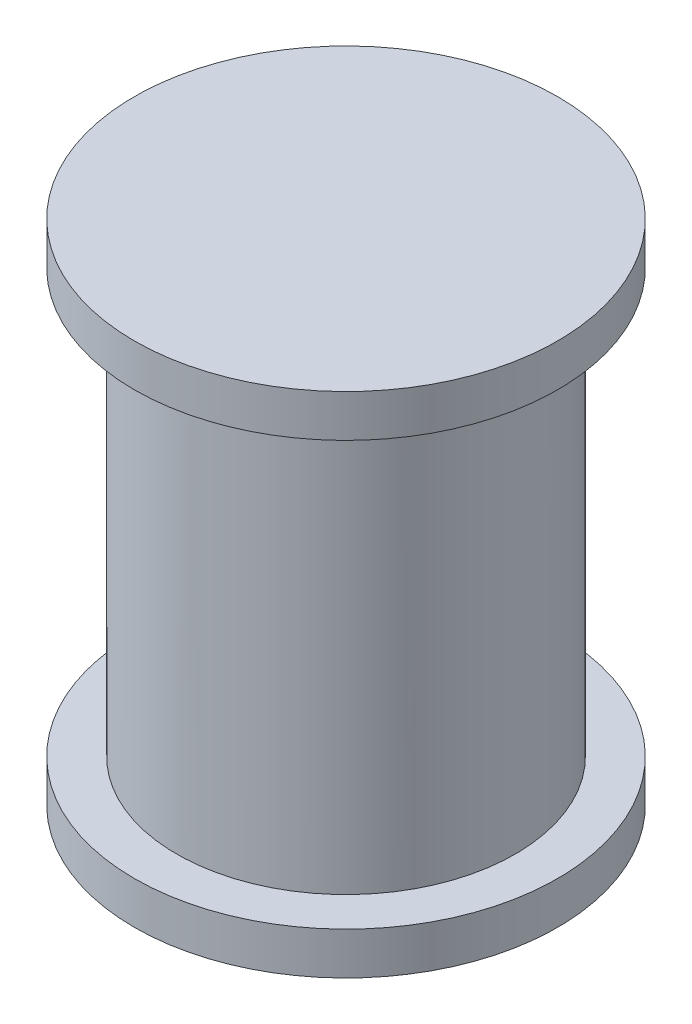
ISO-10303-21;
HEADER;
FILE_DESCRIPTION(('STEP AP214'),'2;1');
FILE_NAME('part.step','',(''),(''),'','','');
FILE_SCHEMA(('AUTOMOTIVE_DESIGN { 1 0 10303 214 1 1 1 1 }'));
ENDSEC;
DATA;
#1=APPLICATION_CONTEXT('core data for automotive mechanical design processes');
#2=APPLICATION_PROTOCOL_DEFINITION('international standard','automotive_design',2000,#1);
#3=PRODUCT_CONTEXT('',#1,'mechanical');
#4=PRODUCT('Part','Part','',(#3));
#5=PRODUCT_RELATED_PRODUCT_CATEGORY('part','',(#4));
#6=PRODUCT_DEFINITION_FORMATION('','',#4);
#7=PRODUCT_DEFINITION_CONTEXT('part definition',#1,'design');
#8=PRODUCT_DEFINITION('design','',#6,#7);
#9=PRODUCT_DEFINITION_SHAPE('','',#8);
#10=(LENGTH_UNIT() NAMED_UNIT(*) SI_UNIT(.MILLI.,.METRE.));
#11=(NAMED_UNIT(*) PLANE_ANGLE_UNIT() SI_UNIT($,.RADIAN.));
#12=(NAMED_UNIT(*) SI_UNIT($,.STERADIAN.) SOLID_ANGLE_UNIT());
#13=UNCERTAINTY_MEASURE_WITH_UNIT(LENGTH_MEASURE(1.E-05),#10,'distance_accuracy_value','');
#14=(GEOMETRIC_REPRESENTATION_CONTEXT(3) GLOBAL_UNCERTAINTY_ASSIGNED_CONTEXT((#13)) GLOBAL_UNIT_ASSIGNED_CONTEXT((#10,
#11,#12)) REPRESENTATION_CONTEXT('',''));
#15=CARTESIAN_POINT('',(0.,0.,0.));
#16=DIRECTION('',(0.,0.,1.));
#17=DIRECTION('',(1.,0.,0.));
#18=AXIS2_PLACEMENT_3D('',#15,#16,#17);
#19=CARTESIAN_POINT('',(0.,10.,0.));
#20=DIRECTION('',(0.,-1.,0.));
#21=DIRECTION('',(0.,0.,-1.));
#22=AXIS2_PLACEMENT_3D('',#19,#20,#21);
#23=CYLINDRICAL_SURFACE('',#22,4.);
#24=CARTESIAN_POINT('',(0.,10.,0.));
#25=DIRECTION('',(0.,1.,0.));
#26=DIRECTION('',(0.,0.,1.));
#27=AXIS2_PLACEMENT_3D('',#24,#25,#26);
#28=CIRCLE('',#27,4.);
#29=CARTESIAN_POINT('',(0.,10.,4.));
#30=VERTEX_POINT('',#29);
#31=EDGE_CURVE('E10',#30,#30,#28,.T.);
#32=ORIENTED_EDGE('',*,*,#31,.F.);
#33=EDGE_LOOP('',(#32));
#34=FACE_BOUND('',#33,.T.);
#35=CARTESIAN_POINT('',(0.,0.,0.));
#36=DIRECTION('',(0.,-1.,0.));
#37=DIRECTION('',(0.,0.,-1.));
#38=AXIS2_PLACEMENT_3D('',#35,#36,#37);
#39=CIRCLE('',#38,4.);
#40=CARTESIAN_POINT('',(0.,0.,-4.));
#41=VERTEX_POINT('',#40);
#42=EDGE_CURVE('E46',#41,#41,#39,.T.);
#43=ORIENTED_EDGE('',*,*,#42,.F.);
#44=EDGE_LOOP('',(#43));
#45=FACE_BOUND('',#44,.T.);
#46=ADVANCED_FACE('F31',(#34,#45),#23,.T.);
#47=CARTESIAN_POINT('',(0.,10.,0.));
#48=DIRECTION('',(0.,1.,0.));
#49=DIRECTION('',(0.,0.,1.));
#50=AXIS2_PLACEMENT_3D('',#47,#48,#49);
#51=PLANE('',#50);
#52=CARTESIAN_POINT('',(0.,10.,0.));
#53=DIRECTION('',(0.,1.,0.));
#54=DIRECTION('',(0.,0.,1.));
#55=AXIS2_PLACEMENT_3D('',#52,#53,#54);
#56=CIRCLE('',#55,5.);
#57=CARTESIAN_POINT('',(0.,10.,5.));
#58=VERTEX_POINT('',#57);
#59=EDGE_CURVE('E41',#58,#58,#56,.T.);
#60=ORIENTED_EDGE('',*,*,#59,.F.);
#61=EDGE_LOOP('',(#60));
#62=FACE_BOUND('',#61,.T.);
#63=ORIENTED_EDGE('',*,*,#31,.T.);
#64=EDGE_LOOP('',(#63));
#65=FACE_BOUND('',#64,.T.);
#66=ADVANCED_FACE('F73',(#62,#65),#51,.F.);
#67=CARTESIAN_POINT('',(0.,11.,0.));
#68=DIRECTION('',(0.,-1.,0.));
#69=DIRECTION('',(0.,0.,-1.));
#70=AXIS2_PLACEMENT_3D('',#67,#68,#69);
#71=CYLINDRICAL_SURFACE('',#70,5.);
#72=CARTESIAN_POINT('',(0.,11.,0.));
#73=DIRECTION('',(0.,1.,0.));
#74=DIRECTION('',(0.,0.,1.));
#75=AXIS2_PLACEMENT_3D('',#72,#73,#74);
#76=CIRCLE('',#75,5.);
#77=CARTESIAN_POINT('',(0.,11.,5.));
#78=VERTEX_POINT('',#77);
#79=EDGE_CURVE('E37',#78,#78,#76,.T.);
#80=ORIENTED_EDGE('',*,*,#79,.F.);
#81=EDGE_LOOP('',(#80));
#82=FACE_BOUND('',#81,.T.);
#83=ORIENTED_EDGE('',*,*,#59,.T.);
#84=EDGE_LOOP('',(#83));
#85=FACE_BOUND('',#84,.T.);
#86=ADVANCED_FACE('F78',(#82,#85),#71,.T.);
#87=CARTESIAN_POINT('',(0.,11.,0.));
#88=DIRECTION('',(0.,1.,0.));
#89=DIRECTION('',(0.,0.,1.));
#90=AXIS2_PLACEMENT_3D('',#87,#88,#89);
#91=PLANE('',#90);
#92=ORIENTED_EDGE('',*,*,#79,.T.);
#93=EDGE_LOOP('',(#92));
#94=FACE_BOUND('',#93,.T.);
#95=ADVANCED_FACE('F68',(#94),#91,.T.);
#96=CARTESIAN_POINT('',(0.,0.,0.));
#97=DIRECTION('',(0.,-1.,0.));
#98=DIRECTION('',(0.,0.,-1.));
#99=AXIS2_PLACEMENT_3D('',#96,#97,#98);
#100=PLANE('',#99);
#101=CARTESIAN_POINT('',(0.,0.,0.));
#102=DIRECTION('',(0.,-1.,0.));
#103=DIRECTION('',(0.,0.,-1.));
#104=AXIS2_PLACEMENT_3D('',#101,#102,#103);
#105=CIRCLE('',#104,5.);
#106=CARTESIAN_POINT('',(0.,0.,-5.));
#107=VERTEX_POINT('',#106);
#108=EDGE_CURVE('E51',#107,#107,#105,.T.);
#109=ORIENTED_EDGE('',*,*,#108,.F.);
#110=EDGE_LOOP('',(#109));
#111=FACE_BOUND('',#110,.T.);
#112=ORIENTED_EDGE('',*,*,#42,.T.);
#113=EDGE_LOOP('',(#112));
#114=FACE_BOUND('',#113,.T.);
#115=ADVANCED_FACE('F62',(#111,#114),#100,.F.);
#116=CARTESIAN_POINT('',(0.,-1.,0.));
#117=DIRECTION('',(0.,1.,0.));
#118=DIRECTION('',(0.,0.,1.));
#119=AXIS2_PLACEMENT_3D('',#116,#117,#118);
#120=CYLINDRICAL_SURFACE('',#119,5.);
#121=CARTESIAN_POINT('',(0.,-1.,0.));
#122=DIRECTION('',(0.,-1.,0.));
#123=DIRECTION('',(0.,0.,-1.));
#124=AXIS2_PLACEMENT_3D('',#121,#122,#123);
#125=CIRCLE('',#124,5.);
#126=CARTESIAN_POINT('',(0.,-1.,-5.));
#127=VERTEX_POINT('',#126);
#128=EDGE_CURVE('E50',#127,#127,#125,.T.);
#129=ORIENTED_EDGE('',*,*,#128,.F.);
#130=EDGE_LOOP('',(#129));
#131=FACE_BOUND('',#130,.T.);
#132=ORIENTED_EDGE('',*,*,#108,.T.);
#133=EDGE_LOOP('',(#132));
#134=FACE_BOUND('',#133,.T.);
#135=ADVANCED_FACE('F59',(#131,#134),#120,.T.);
#136=CARTESIAN_POINT('',(0.,-1.,0.));
#137=DIRECTION('',(0.,-1.,0.));
#138=DIRECTION('',(0.,0.,-1.));
#139=AXIS2_PLACEMENT_3D('',#136,#137,#138);
#140=PLANE('',#139);
#141=ORIENTED_EDGE('',*,*,#128,.T.);
#142=EDGE_LOOP('',(#141));
#143=FACE_BOUND('',#142,.T.);
#144=ADVANCED_FACE('F57',(#143),#140,.T.);
#145=CLOSED_SHELL('',(#46,#66,#86,#95,#115,#135,#144));
#146=MANIFOLD_SOLID_BREP('B2',#145);
#147=ADVANCED_BREP_SHAPE_REPRESENTATION('',(#18,#146),#14);
#148=SHAPE_DEFINITION_REPRESENTATION(#9,#147);
ENDSEC;
END-ISO-10303-21;
